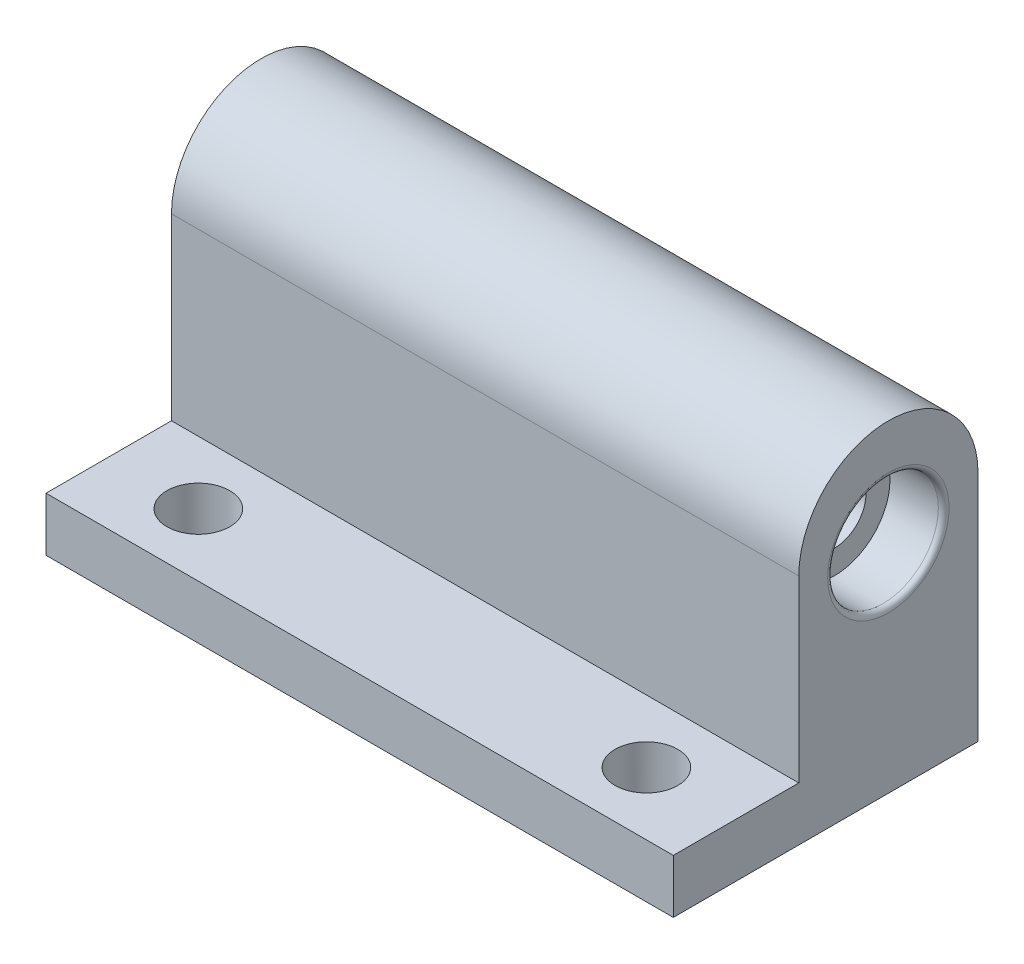
ISO-10303-21;
HEADER;
FILE_DESCRIPTION(('STEP AP214'),'2;1');
FILE_NAME('part.step','',(''),(''),'','','');
FILE_SCHEMA(('AUTOMOTIVE_DESIGN { 1 0 10303 214 1 1 1 1 }'));
ENDSEC;
DATA;
#1=APPLICATION_CONTEXT('core data for automotive mechanical design processes');
#2=APPLICATION_PROTOCOL_DEFINITION('international standard','automotive_design',2000,#1);
#3=PRODUCT_CONTEXT('',#1,'mechanical');
#4=PRODUCT('Part','Part','',(#3));
#5=PRODUCT_RELATED_PRODUCT_CATEGORY('part','',(#4));
#6=PRODUCT_DEFINITION_FORMATION('','',#4);
#7=PRODUCT_DEFINITION_CONTEXT('part definition',#1,'design');
#8=PRODUCT_DEFINITION('design','',#6,#7);
#9=PRODUCT_DEFINITION_SHAPE('','',#8);
#10=(LENGTH_UNIT() NAMED_UNIT(*) SI_UNIT(.MILLI.,.METRE.));
#11=(NAMED_UNIT(*) PLANE_ANGLE_UNIT() SI_UNIT($,.RADIAN.));
#12=(NAMED_UNIT(*) SI_UNIT($,.STERADIAN.) SOLID_ANGLE_UNIT());
#13=UNCERTAINTY_MEASURE_WITH_UNIT(LENGTH_MEASURE(1.E-05),#10,'distance_accuracy_value','');
#14=(GEOMETRIC_REPRESENTATION_CONTEXT(3) GLOBAL_UNCERTAINTY_ASSIGNED_CONTEXT((#13)) GLOBAL_UNIT_ASSIGNED_CONTEXT((#10,
#11,#12)) REPRESENTATION_CONTEXT('',''));
#15=CARTESIAN_POINT('',(0.,0.,0.));
#16=DIRECTION('',(0.,0.,1.));
#17=DIRECTION('',(1.,0.,0.));
#18=AXIS2_PLACEMENT_3D('',#15,#16,#17);
#19=CARTESIAN_POINT('',(-17.5,12.1,0.));
#20=DIRECTION('',(1.,0.,0.));
#21=DIRECTION('',(0.,0.,-1.));
#22=AXIS2_PLACEMENT_3D('',#19,#20,#21);
#23=CYLINDRICAL_SURFACE('',#22,1.75);
#24=CARTESIAN_POINT('',(14.5,12.1,0.));
#25=DIRECTION('',(1.,0.,0.));
#26=DIRECTION('',(0.,0.,-1.));
#27=AXIS2_PLACEMENT_3D('',#24,#25,#26);
#28=CIRCLE('',#27,1.75);
#29=CARTESIAN_POINT('',(14.5,12.1,-1.75));
#30=VERTEX_POINT('',#29);
#31=EDGE_CURVE('E164',#30,#30,#28,.T.);
#32=ORIENTED_EDGE('',*,*,#31,.T.);
#33=EDGE_LOOP('',(#32));
#34=FACE_BOUND('',#33,.T.);
#35=CARTESIAN_POINT('',(-14.5,12.1,0.));
#36=DIRECTION('',(-1.,0.,0.));
#37=DIRECTION('',(0.,0.,1.));
#38=AXIS2_PLACEMENT_3D('',#35,#36,#37);
#39=CIRCLE('',#38,1.75);
#40=CARTESIAN_POINT('',(-14.5,12.1,1.75));
#41=VERTEX_POINT('',#40);
#42=EDGE_CURVE('E163',#41,#41,#39,.F.);
#43=ORIENTED_EDGE('',*,*,#42,.F.);
#44=EDGE_LOOP('',(#43));
#45=FACE_BOUND('',#44,.T.);
#46=ADVANCED_FACE('F43',(#34,#45),#23,.F.);
#47=CARTESIAN_POINT('',(17.5,22.1,-15.));
#48=DIRECTION('',(-1.,0.,0.));
#49=DIRECTION('',(0.,0.,1.));
#50=AXIS2_PLACEMENT_3D('',#47,#48,#49);
#51=PLANE('',#50);
#52=CARTESIAN_POINT('',(17.5,12.1,0.));
#53=DIRECTION('',(-1.,0.,0.));
#54=DIRECTION('',(0.,0.,1.));
#55=AXIS2_PLACEMENT_3D('',#52,#53,#54);
#56=CIRCLE('',#55,3.3875);
#57=CARTESIAN_POINT('',(17.5,12.1,3.3875));
#58=VERTEX_POINT('',#57);
#59=EDGE_CURVE('E186',#58,#58,#56,.T.);
#60=ORIENTED_EDGE('',*,*,#59,.T.);
#61=EDGE_LOOP('',(#60));
#62=FACE_BOUND('',#61,.T.);
#63=DIRECTION('',(0.,0.,1.));
#64=VECTOR('',#63,1.);
#65=CARTESIAN_POINT('',(17.5,3.,4.99999999999999));
#66=LINE('',#65,#64);
#67=CARTESIAN_POINT('',(17.5,3.,4.99999999999999));
#68=VERTEX_POINT('',#67);
#69=CARTESIAN_POINT('',(17.5,3.,12.));
#70=VERTEX_POINT('',#69);
#71=EDGE_CURVE('E146',#68,#70,#66,.T.);
#72=ORIENTED_EDGE('',*,*,#71,.T.);
#73=DIRECTION('',(0.,1.,0.));
#74=VECTOR('',#73,1.);
#75=CARTESIAN_POINT('',(17.5,-7.,12.));
#76=LINE('',#75,#74);
#77=CARTESIAN_POINT('',(17.5,0.,12.));
#78=VERTEX_POINT('',#77);
#79=EDGE_CURVE('E59',#78,#70,#76,.T.);
#80=ORIENTED_EDGE('',*,*,#79,.F.);
#81=DIRECTION('',(0.,0.,-1.));
#82=VECTOR('',#81,1.);
#83=CARTESIAN_POINT('',(17.5,0.,-15.));
#84=LINE('',#83,#82);
#85=CARTESIAN_POINT('',(17.5,0.,-5.00000000000001));
#86=VERTEX_POINT('',#85);
#87=EDGE_CURVE('E66',#78,#86,#84,.T.);
#88=ORIENTED_EDGE('',*,*,#87,.T.);
#89=DIRECTION('',(0.,1.,0.));
#90=VECTOR('',#89,1.);
#91=CARTESIAN_POINT('',(17.5,3.,-5.));
#92=LINE('',#91,#90);
#93=CARTESIAN_POINT('',(17.5,13.,-5.00000000000001));
#94=VERTEX_POINT('',#93);
#95=EDGE_CURVE('E123',#86,#94,#92,.T.);
#96=ORIENTED_EDGE('',*,*,#95,.T.);
#97=CARTESIAN_POINT('',(17.5,13.,0.));
#98=DIRECTION('',(1.,0.,0.));
#99=DIRECTION('',(0.,0.,-1.));
#100=AXIS2_PLACEMENT_3D('',#97,#98,#99);
#101=CIRCLE('',#100,5.);
#102=CARTESIAN_POINT('',(17.5,13.,4.99999999999999));
#103=VERTEX_POINT('',#102);
#104=EDGE_CURVE('E128',#94,#103,#101,.T.);
#105=ORIENTED_EDGE('',*,*,#104,.T.);
#106=DIRECTION('',(0.,-1.,0.));
#107=VECTOR('',#106,1.);
#108=CARTESIAN_POINT('',(17.5,13.,4.99999999999999));
#109=LINE('',#108,#107);
#110=EDGE_CURVE('E407',#103,#68,#109,.T.);
#111=ORIENTED_EDGE('',*,*,#110,.T.);
#112=EDGE_LOOP('',(#72,#80,#88,#96,#105,#111));
#113=FACE_BOUND('',#112,.T.);
#114=ADVANCED_FACE('F208',(#62,#113),#51,.F.);
#115=CARTESIAN_POINT('',(-17.5,22.1,-15.));
#116=DIRECTION('',(1.,0.,0.));
#117=DIRECTION('',(0.,0.,-1.));
#118=AXIS2_PLACEMENT_3D('',#115,#116,#117);
#119=PLANE('',#118);
#120=CARTESIAN_POINT('',(-17.5,12.1,0.));
#121=DIRECTION('',(1.,0.,0.));
#122=DIRECTION('',(0.,0.,-1.));
#123=AXIS2_PLACEMENT_3D('',#120,#121,#122);
#124=CIRCLE('',#123,3.3875);
#125=CARTESIAN_POINT('',(-17.5,12.1,-3.3875));
#126=VERTEX_POINT('',#125);
#127=EDGE_CURVE('E11',#126,#126,#124,.T.);
#128=ORIENTED_EDGE('',*,*,#127,.T.);
#129=EDGE_LOOP('',(#128));
#130=FACE_BOUND('',#129,.T.);
#131=DIRECTION('',(0.,0.,1.));
#132=VECTOR('',#131,1.);
#133=CARTESIAN_POINT('',(-17.5,0.,-15.));
#134=LINE('',#133,#132);
#135=CARTESIAN_POINT('',(-17.5,0.,-5.));
#136=VERTEX_POINT('',#135);
#137=CARTESIAN_POINT('',(-17.5,0.,12.));
#138=VERTEX_POINT('',#137);
#139=EDGE_CURVE('E114',#136,#138,#134,.T.);
#140=ORIENTED_EDGE('',*,*,#139,.T.);
#141=DIRECTION('',(0.,1.,0.));
#142=VECTOR('',#141,1.);
#143=CARTESIAN_POINT('',(-17.5,-7.,12.));
#144=LINE('',#143,#142);
#145=CARTESIAN_POINT('',(-17.5,3.,12.));
#146=VERTEX_POINT('',#145);
#147=EDGE_CURVE('E98',#138,#146,#144,.T.);
#148=ORIENTED_EDGE('',*,*,#147,.T.);
#149=DIRECTION('',(0.,0.,1.));
#150=VECTOR('',#149,1.);
#151=CARTESIAN_POINT('',(-17.5,3.,5.));
#152=LINE('',#151,#150);
#153=CARTESIAN_POINT('',(-17.5,3.,5.));
#154=VERTEX_POINT('',#153);
#155=EDGE_CURVE('E111',#154,#146,#152,.T.);
#156=ORIENTED_EDGE('',*,*,#155,.F.);
#157=DIRECTION('',(0.,-1.,0.));
#158=VECTOR('',#157,1.);
#159=CARTESIAN_POINT('',(-17.5,13.,5.));
#160=LINE('',#159,#158);
#161=CARTESIAN_POINT('',(-17.5,13.,5.));
#162=VERTEX_POINT('',#161);
#163=EDGE_CURVE('E124',#162,#154,#160,.T.);
#164=ORIENTED_EDGE('',*,*,#163,.F.);
#165=CARTESIAN_POINT('',(-17.5,13.,0.));
#166=DIRECTION('',(1.,0.,0.));
#167=DIRECTION('',(0.,0.,-1.));
#168=AXIS2_PLACEMENT_3D('',#165,#166,#167);
#169=CIRCLE('',#168,5.);
#170=CARTESIAN_POINT('',(-17.5,13.,-5.));
#171=VERTEX_POINT('',#170);
#172=EDGE_CURVE('E130',#171,#162,#169,.T.);
#173=ORIENTED_EDGE('',*,*,#172,.F.);
#174=DIRECTION('',(0.,1.,0.));
#175=VECTOR('',#174,1.);
#176=CARTESIAN_POINT('',(-17.5,3.,-5.));
#177=LINE('',#176,#175);
#178=EDGE_CURVE('E396',#136,#171,#177,.T.);
#179=ORIENTED_EDGE('',*,*,#178,.F.);
#180=EDGE_LOOP('',(#140,#148,#156,#164,#173,#179));
#181=FACE_BOUND('',#180,.T.);
#182=ADVANCED_FACE('F109',(#130,#181),#119,.F.);
#183=CARTESIAN_POINT('',(0.,0.,0.));
#184=DIRECTION('',(0.,1.,0.));
#185=DIRECTION('',(0.,0.,1.));
#186=AXIS2_PLACEMENT_3D('',#183,#184,#185);
#187=PLANE('',#186);
#188=CARTESIAN_POINT('',(-12.5,0.,8.5));
#189=DIRECTION('',(0.,1.,0.));
#190=DIRECTION('',(0.,0.,1.));
#191=AXIS2_PLACEMENT_3D('',#188,#189,#190);
#192=CIRCLE('',#191,1.75);
#193=CARTESIAN_POINT('',(-12.5,0.,10.25));
#194=VERTEX_POINT('',#193);
#195=EDGE_CURVE('E151',#194,#194,#192,.T.);
#196=ORIENTED_EDGE('',*,*,#195,.T.);
#197=EDGE_LOOP('',(#196));
#198=FACE_BOUND('',#197,.T.);
#199=CARTESIAN_POINT('',(12.5,0.,8.5));
#200=DIRECTION('',(0.,1.,0.));
#201=DIRECTION('',(0.,0.,1.));
#202=AXIS2_PLACEMENT_3D('',#199,#200,#201);
#203=CIRCLE('',#202,1.75);
#204=CARTESIAN_POINT('',(12.5,0.,10.25));
#205=VERTEX_POINT('',#204);
#206=EDGE_CURVE('E152',#205,#205,#203,.T.);
#207=ORIENTED_EDGE('',*,*,#206,.T.);
#208=EDGE_LOOP('',(#207));
#209=FACE_BOUND('',#208,.T.);
#210=ORIENTED_EDGE('',*,*,#87,.F.);
#211=DIRECTION('',(-1.,0.,0.));
#212=VECTOR('',#211,1.);
#213=CARTESIAN_POINT('',(0.,0.,12.));
#214=LINE('',#213,#212);
#215=EDGE_CURVE('E116',#78,#138,#214,.T.);
#216=ORIENTED_EDGE('',*,*,#215,.T.);
#217=ORIENTED_EDGE('',*,*,#139,.F.);
#218=DIRECTION('',(-1.,0.,0.));
#219=VECTOR('',#218,1.);
#220=CARTESIAN_POINT('',(17.5,0.,-5.));
#221=LINE('',#220,#219);
#222=EDGE_CURVE('E143',#86,#136,#221,.T.);
#223=ORIENTED_EDGE('',*,*,#222,.F.);
#224=EDGE_LOOP('',(#210,#216,#217,#223));
#225=FACE_BOUND('',#224,.T.);
#226=ADVANCED_FACE('F228',(#198,#209,#225),#187,.F.);
#227=CARTESIAN_POINT('',(14.5,12.1,0.));
#228=DIRECTION('',(1.,0.,0.));
#229=DIRECTION('',(0.,0.,-1.));
#230=AXIS2_PLACEMENT_3D('',#227,#228,#229);
#231=CYLINDRICAL_SURFACE('',#230,3.0875);
#232=CARTESIAN_POINT('',(17.2,12.1,0.));
#233=DIRECTION('',(-1.,0.,0.));
#234=DIRECTION('',(0.,0.,1.));
#235=AXIS2_PLACEMENT_3D('',#232,#233,#234);
#236=CIRCLE('',#235,3.0875);
#237=CARTESIAN_POINT('',(17.2,12.1,3.0875));
#238=VERTEX_POINT('',#237);
#239=EDGE_CURVE('E176',#238,#238,#236,.F.);
#240=ORIENTED_EDGE('',*,*,#239,.T.);
#241=EDGE_LOOP('',(#240));
#242=FACE_BOUND('',#241,.T.);
#243=CARTESIAN_POINT('',(14.5,12.1,0.));
#244=DIRECTION('',(1.,0.,0.));
#245=DIRECTION('',(0.,0.,-1.));
#246=AXIS2_PLACEMENT_3D('',#243,#244,#245);
#247=CIRCLE('',#246,3.0875);
#248=CARTESIAN_POINT('',(14.5,12.1,-3.0875));
#249=VERTEX_POINT('',#248);
#250=EDGE_CURVE('E168',#249,#249,#247,.T.);
#251=ORIENTED_EDGE('',*,*,#250,.F.);
#252=EDGE_LOOP('',(#251));
#253=FACE_BOUND('',#252,.T.);
#254=ADVANCED_FACE('F224',(#242,#253),#231,.F.);
#255=CARTESIAN_POINT('',(14.5,12.1,0.));
#256=DIRECTION('',(1.,0.,0.));
#257=DIRECTION('',(0.,0.,-1.));
#258=AXIS2_PLACEMENT_3D('',#255,#256,#257);
#259=PLANE('',#258);
#260=ORIENTED_EDGE('',*,*,#31,.F.);
#261=EDGE_LOOP('',(#260));
#262=FACE_BOUND('',#261,.T.);
#263=ORIENTED_EDGE('',*,*,#250,.T.);
#264=EDGE_LOOP('',(#263));
#265=FACE_BOUND('',#264,.T.);
#266=ADVANCED_FACE('F220',(#262,#265),#259,.T.);
#267=CARTESIAN_POINT('',(-14.5,12.1,0.));
#268=DIRECTION('',(-1.,0.,0.));
#269=DIRECTION('',(0.,0.,1.));
#270=AXIS2_PLACEMENT_3D('',#267,#268,#269);
#271=PLANE('',#270);
#272=CARTESIAN_POINT('',(-14.5,12.1,0.));
#273=DIRECTION('',(-1.,0.,0.));
#274=DIRECTION('',(0.,0.,1.));
#275=AXIS2_PLACEMENT_3D('',#272,#273,#274);
#276=CIRCLE('',#275,3.0875);
#277=CARTESIAN_POINT('',(-14.5,12.1,3.0875));
#278=VERTEX_POINT('',#277);
#279=EDGE_CURVE('E156',#278,#278,#276,.T.);
#280=ORIENTED_EDGE('',*,*,#279,.T.);
#281=EDGE_LOOP('',(#280));
#282=FACE_BOUND('',#281,.T.);
#283=ORIENTED_EDGE('',*,*,#42,.T.);
#284=EDGE_LOOP('',(#283));
#285=FACE_BOUND('',#284,.T.);
#286=ADVANCED_FACE('F223',(#282,#285),#271,.T.);
#287=CARTESIAN_POINT('',(-14.5,12.1,0.));
#288=DIRECTION('',(-1.,0.,0.));
#289=DIRECTION('',(0.,0.,1.));
#290=AXIS2_PLACEMENT_3D('',#287,#288,#289);
#291=CYLINDRICAL_SURFACE('',#290,3.0875);
#292=CARTESIAN_POINT('',(-17.2,12.1,0.));
#293=DIRECTION('',(1.,0.,0.));
#294=DIRECTION('',(0.,0.,-1.));
#295=AXIS2_PLACEMENT_3D('',#292,#293,#294);
#296=CIRCLE('',#295,3.0875);
#297=CARTESIAN_POINT('',(-17.2,12.1,-3.0875));
#298=VERTEX_POINT('',#297);
#299=EDGE_CURVE('E52',#298,#298,#296,.F.);
#300=ORIENTED_EDGE('',*,*,#299,.T.);
#301=EDGE_LOOP('',(#300));
#302=FACE_BOUND('',#301,.T.);
#303=ORIENTED_EDGE('',*,*,#279,.F.);
#304=EDGE_LOOP('',(#303));
#305=FACE_BOUND('',#304,.T.);
#306=ADVANCED_FACE('F193',(#302,#305),#291,.F.);
#307=CARTESIAN_POINT('',(12.5,0.,8.5));
#308=DIRECTION('',(0.,1.,0.));
#309=DIRECTION('',(0.,0.,1.));
#310=AXIS2_PLACEMENT_3D('',#307,#308,#309);
#311=CYLINDRICAL_SURFACE('',#310,1.75);
#312=CARTESIAN_POINT('',(12.5,3.,8.5));
#313=DIRECTION('',(0.,-1.,0.));
#314=DIRECTION('',(0.,0.,-1.));
#315=AXIS2_PLACEMENT_3D('',#312,#313,#314);
#316=CIRCLE('',#315,1.75);
#317=CARTESIAN_POINT('',(12.5,3.,6.75));
#318=VERTEX_POINT('',#317);
#319=EDGE_CURVE('E147',#318,#318,#316,.F.);
#320=ORIENTED_EDGE('',*,*,#319,.T.);
#321=EDGE_LOOP('',(#320));
#322=FACE_BOUND('',#321,.T.);
#323=ORIENTED_EDGE('',*,*,#206,.F.);
#324=EDGE_LOOP('',(#323));
#325=FACE_BOUND('',#324,.T.);
#326=ADVANCED_FACE('F266',(#322,#325),#311,.F.);
#327=CARTESIAN_POINT('',(-12.5,0.,8.5));
#328=DIRECTION('',(0.,1.,0.));
#329=DIRECTION('',(0.,0.,1.));
#330=AXIS2_PLACEMENT_3D('',#327,#328,#329);
#331=CYLINDRICAL_SURFACE('',#330,1.75);
#332=CARTESIAN_POINT('',(-12.5,3.,8.5));
#333=DIRECTION('',(0.,-1.,0.));
#334=DIRECTION('',(0.,0.,-1.));
#335=AXIS2_PLACEMENT_3D('',#332,#333,#334);
#336=CIRCLE('',#335,1.75);
#337=CARTESIAN_POINT('',(-12.5,3.,6.75));
#338=VERTEX_POINT('',#337);
#339=EDGE_CURVE('E136',#338,#338,#336,.F.);
#340=ORIENTED_EDGE('',*,*,#339,.T.);
#341=EDGE_LOOP('',(#340));
#342=FACE_BOUND('',#341,.T.);
#343=ORIENTED_EDGE('',*,*,#195,.F.);
#344=EDGE_LOOP('',(#343));
#345=FACE_BOUND('',#344,.T.);
#346=ADVANCED_FACE('F272',(#342,#345),#331,.F.);
#347=CARTESIAN_POINT('',(17.5,3.,4.99999999999999));
#348=DIRECTION('',(0.,-1.,0.));
#349=DIRECTION('',(0.,0.,-1.));
#350=AXIS2_PLACEMENT_3D('',#347,#348,#349);
#351=PLANE('',#350);
#352=ORIENTED_EDGE('',*,*,#339,.F.);
#353=EDGE_LOOP('',(#352));
#354=FACE_BOUND('',#353,.T.);
#355=ORIENTED_EDGE('',*,*,#155,.T.);
#356=DIRECTION('',(-1.,0.,0.));
#357=VECTOR('',#356,1.);
#358=CARTESIAN_POINT('',(-17.5,3.,12.));
#359=LINE('',#358,#357);
#360=EDGE_CURVE('E95',#70,#146,#359,.T.);
#361=ORIENTED_EDGE('',*,*,#360,.F.);
#362=ORIENTED_EDGE('',*,*,#71,.F.);
#363=DIRECTION('',(-1.,0.,0.));
#364=VECTOR('',#363,1.);
#365=CARTESIAN_POINT('',(17.5,3.,4.99999999999999));
#366=LINE('',#365,#364);
#367=EDGE_CURVE('E120',#68,#154,#366,.T.);
#368=ORIENTED_EDGE('',*,*,#367,.T.);
#369=EDGE_LOOP('',(#355,#361,#362,#368));
#370=FACE_BOUND('',#369,.T.);
#371=ORIENTED_EDGE('',*,*,#319,.F.);
#372=EDGE_LOOP('',(#371));
#373=FACE_BOUND('',#372,.T.);
#374=ADVANCED_FACE('F118',(#354,#370,#373),#351,.F.);
#375=CARTESIAN_POINT('',(17.5,13.,4.99999999999999));
#376=DIRECTION('',(0.,0.,-1.));
#377=DIRECTION('',(0.,1.,0.));
#378=AXIS2_PLACEMENT_3D('',#375,#376,#377);
#379=PLANE('',#378);
#380=ORIENTED_EDGE('',*,*,#163,.T.);
#381=ORIENTED_EDGE('',*,*,#367,.F.);
#382=ORIENTED_EDGE('',*,*,#110,.F.);
#383=DIRECTION('',(-1.,0.,0.));
#384=VECTOR('',#383,1.);
#385=CARTESIAN_POINT('',(17.5,13.,4.99999999999999));
#386=LINE('',#385,#384);
#387=EDGE_CURVE('E137',#103,#162,#386,.T.);
#388=ORIENTED_EDGE('',*,*,#387,.T.);
#389=EDGE_LOOP('',(#380,#381,#382,#388));
#390=FACE_BOUND('',#389,.T.);
#391=ADVANCED_FACE('F287',(#390),#379,.F.);
#392=CARTESIAN_POINT('',(17.5,13.,0.));
#393=DIRECTION('',(-1.,0.,0.));
#394=DIRECTION('',(0.,0.,1.));
#395=AXIS2_PLACEMENT_3D('',#392,#393,#394);
#396=CYLINDRICAL_SURFACE('',#395,5.);
#397=ORIENTED_EDGE('',*,*,#172,.T.);
#398=ORIENTED_EDGE('',*,*,#387,.F.);
#399=ORIENTED_EDGE('',*,*,#104,.F.);
#400=DIRECTION('',(-1.,0.,0.));
#401=VECTOR('',#400,1.);
#402=CARTESIAN_POINT('',(17.5,13.,-5.00000000000001));
#403=LINE('',#402,#401);
#404=EDGE_CURVE('E140',#94,#171,#403,.T.);
#405=ORIENTED_EDGE('',*,*,#404,.T.);
#406=EDGE_LOOP('',(#397,#398,#399,#405));
#407=FACE_BOUND('',#406,.T.);
#408=ADVANCED_FACE('F295',(#407),#396,.T.);
#409=CARTESIAN_POINT('',(17.5,3.,-5.));
#410=DIRECTION('',(0.,0.,1.));
#411=DIRECTION('',(0.,-1.,0.));
#412=AXIS2_PLACEMENT_3D('',#409,#410,#411);
#413=PLANE('',#412);
#414=ORIENTED_EDGE('',*,*,#178,.T.);
#415=ORIENTED_EDGE('',*,*,#404,.F.);
#416=ORIENTED_EDGE('',*,*,#95,.F.);
#417=ORIENTED_EDGE('',*,*,#222,.T.);
#418=EDGE_LOOP('',(#414,#415,#416,#417));
#419=FACE_BOUND('',#418,.T.);
#420=ADVANCED_FACE('F204',(#419),#413,.F.);
#421=CARTESIAN_POINT('',(17.2,12.1,0.));
#422=DIRECTION('',(-1.,0.,0.));
#423=DIRECTION('',(0.,0.,1.));
#424=AXIS2_PLACEMENT_3D('',#421,#422,#423);
#425=TOROIDAL_SURFACE('',#424,3.3875,0.3);
#426=ORIENTED_EDGE('',*,*,#59,.F.);
#427=EDGE_LOOP('',(#426));
#428=FACE_BOUND('',#427,.T.);
#429=ORIENTED_EDGE('',*,*,#239,.F.);
#430=EDGE_LOOP('',(#429));
#431=FACE_BOUND('',#430,.T.);
#432=ADVANCED_FACE('F197',(#428,#431),#425,.T.);
#433=CARTESIAN_POINT('',(-17.2,12.1,0.));
#434=DIRECTION('',(1.,0.,0.));
#435=DIRECTION('',(0.,0.,-1.));
#436=AXIS2_PLACEMENT_3D('',#433,#434,#435);
#437=TOROIDAL_SURFACE('',#436,3.3875,0.3);
#438=ORIENTED_EDGE('',*,*,#127,.F.);
#439=EDGE_LOOP('',(#438));
#440=FACE_BOUND('',#439,.T.);
#441=ORIENTED_EDGE('',*,*,#299,.F.);
#442=EDGE_LOOP('',(#441));
#443=FACE_BOUND('',#442,.T.);
#444=ADVANCED_FACE('F45',(#440,#443),#437,.T.);
#445=CARTESIAN_POINT('',(-17.5,-7.,12.));
#446=DIRECTION('',(0.,0.,-1.));
#447=DIRECTION('',(0.,1.,0.));
#448=AXIS2_PLACEMENT_3D('',#445,#446,#447);
#449=PLANE('',#448);
#450=ORIENTED_EDGE('',*,*,#79,.T.);
#451=ORIENTED_EDGE('',*,*,#360,.T.);
#452=ORIENTED_EDGE('',*,*,#147,.F.);
#453=ORIENTED_EDGE('',*,*,#215,.F.);
#454=EDGE_LOOP('',(#450,#451,#452,#453));
#455=FACE_BOUND('',#454,.T.);
#456=ADVANCED_FACE('F97',(#455),#449,.F.);
#457=CLOSED_SHELL('',(#46,#114,#182,#226,#254,#266,#286,#306,#326,#346,#374,#391,#408,#420,#432,
#444,#456));
#458=MANIFOLD_SOLID_BREP('B2',#457);
#459=ADVANCED_BREP_SHAPE_REPRESENTATION('',(#18,#458),#14);
#460=SHAPE_DEFINITION_REPRESENTATION(#9,#459);
ENDSEC;
END-ISO-10303-21;
